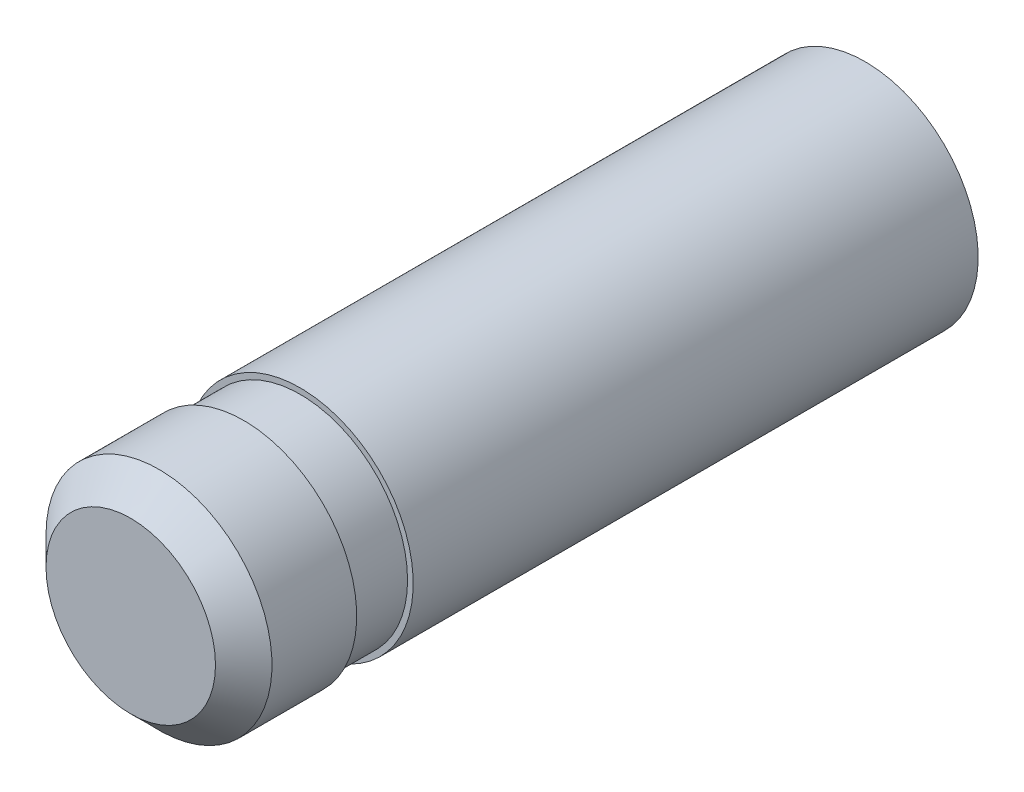
ISO-10303-21;
HEADER;
FILE_DESCRIPTION(('STEP AP214'),'2;1');
FILE_NAME('part.step','',(''),(''),'','','');
FILE_SCHEMA(('AUTOMOTIVE_DESIGN { 1 0 10303 214 1 1 1 1 }'));
ENDSEC;
DATA;
#1=APPLICATION_CONTEXT('core data for automotive mechanical design processes');
#2=APPLICATION_PROTOCOL_DEFINITION('international standard','automotive_design',2000,#1);
#3=PRODUCT_CONTEXT('',#1,'mechanical');
#4=PRODUCT('Part','Part','',(#3));
#5=PRODUCT_RELATED_PRODUCT_CATEGORY('part','',(#4));
#6=PRODUCT_DEFINITION_FORMATION('','',#4);
#7=PRODUCT_DEFINITION_CONTEXT('part definition',#1,'design');
#8=PRODUCT_DEFINITION('design','',#6,#7);
#9=PRODUCT_DEFINITION_SHAPE('','',#8);
#10=(LENGTH_UNIT() NAMED_UNIT(*) SI_UNIT(.MILLI.,.METRE.));
#11=(NAMED_UNIT(*) PLANE_ANGLE_UNIT() SI_UNIT($,.RADIAN.));
#12=(NAMED_UNIT(*) SI_UNIT($,.STERADIAN.) SOLID_ANGLE_UNIT());
#13=UNCERTAINTY_MEASURE_WITH_UNIT(LENGTH_MEASURE(1.E-05),#10,'distance_accuracy_value','');
#14=(GEOMETRIC_REPRESENTATION_CONTEXT(3) GLOBAL_UNCERTAINTY_ASSIGNED_CONTEXT((#13)) GLOBAL_UNIT_ASSIGNED_CONTEXT((#10,
#11,#12)) REPRESENTATION_CONTEXT('',''));
#15=CARTESIAN_POINT('',(0.,0.,0.));
#16=DIRECTION('',(0.,0.,1.));
#17=DIRECTION('',(1.,0.,0.));
#18=AXIS2_PLACEMENT_3D('',#15,#16,#17);
#19=CARTESIAN_POINT('',(0.,0.,13.));
#20=DIRECTION('',(0.,0.,-1.));
#21=DIRECTION('',(-1.,0.,0.));
#22=AXIS2_PLACEMENT_3D('',#19,#20,#21);
#23=CYLINDRICAL_SURFACE('',#22,2.);
#24=CARTESIAN_POINT('',(0.,0.,12.5));
#25=DIRECTION('',(0.,0.,1.));
#26=DIRECTION('',(1.,0.,0.));
#27=AXIS2_PLACEMENT_3D('',#24,#25,#26);
#28=CIRCLE('',#27,2.);
#29=CARTESIAN_POINT('',(-2.,0.,12.5));
#30=VERTEX_POINT('',#29);
#31=EDGE_CURVE('E11',#30,#30,#28,.F.);
#32=CARTESIAN_POINT('',(0.,0.,11.));
#33=DIRECTION('',(0.,0.,-1.));
#34=DIRECTION('',(-1.,0.,0.));
#35=AXIS2_PLACEMENT_3D('',#32,#33,#34);
#36=CIRCLE('',#35,2.);
#37=CARTESIAN_POINT('',(-2.,0.,11.));
#38=VERTEX_POINT('',#37);
#39=EDGE_CURVE('E59',#38,#38,#36,.T.);
#40=CARTESIAN_POINT('',(-2.,0.,12.5));
#41=CARTESIAN_POINT('',(-2.,0.,12.484375));
#42=CARTESIAN_POINT('',(-2.,0.,12.46875));
#43=CARTESIAN_POINT('',(-2.,0.,12.4375));
#44=CARTESIAN_POINT('',(-2.,0.,12.421875));
#45=CARTESIAN_POINT('',(-2.,0.,12.390625));
#46=CARTESIAN_POINT('',(-2.,0.,12.375));
#47=CARTESIAN_POINT('',(-2.,0.,12.34375));
#48=CARTESIAN_POINT('',(-2.,0.,12.328125));
#49=CARTESIAN_POINT('',(-2.,0.,12.296875));
#50=CARTESIAN_POINT('',(-2.,0.,12.28125));
#51=CARTESIAN_POINT('',(-2.,0.,12.25));
#52=CARTESIAN_POINT('',(-2.,0.,12.234375));
#53=CARTESIAN_POINT('',(-2.,0.,12.203125));
#54=CARTESIAN_POINT('',(-2.,0.,12.1875));
#55=CARTESIAN_POINT('',(-2.,0.,12.15625));
#56=CARTESIAN_POINT('',(-2.,0.,12.140625));
#57=CARTESIAN_POINT('',(-2.,0.,12.109375));
#58=CARTESIAN_POINT('',(-2.,0.,12.09375));
#59=CARTESIAN_POINT('',(-2.,0.,12.0625));
#60=CARTESIAN_POINT('',(-2.,0.,12.046875));
#61=CARTESIAN_POINT('',(-2.,0.,12.015625));
#62=CARTESIAN_POINT('',(-2.,0.,12.));
#63=CARTESIAN_POINT('',(-2.,0.,11.96875));
#64=CARTESIAN_POINT('',(-2.,0.,11.953125));
#65=CARTESIAN_POINT('',(-2.,0.,11.921875));
#66=CARTESIAN_POINT('',(-2.,0.,11.90625));
#67=CARTESIAN_POINT('',(-2.,0.,11.875));
#68=CARTESIAN_POINT('',(-2.,0.,11.859375));
#69=CARTESIAN_POINT('',(-2.,0.,11.828125));
#70=CARTESIAN_POINT('',(-2.,0.,11.8125));
#71=CARTESIAN_POINT('',(-2.,0.,11.78125));
#72=CARTESIAN_POINT('',(-2.,0.,11.765625));
#73=CARTESIAN_POINT('',(-2.,0.,11.734375));
#74=CARTESIAN_POINT('',(-2.,0.,11.71875));
#75=CARTESIAN_POINT('',(-2.,0.,11.6875));
#76=CARTESIAN_POINT('',(-2.,0.,11.671875));
#77=CARTESIAN_POINT('',(-2.,0.,11.640625));
#78=CARTESIAN_POINT('',(-2.,0.,11.625));
#79=CARTESIAN_POINT('',(-2.,0.,11.59375));
#80=CARTESIAN_POINT('',(-2.,0.,11.578125));
#81=CARTESIAN_POINT('',(-2.,0.,11.546875));
#82=CARTESIAN_POINT('',(-2.,0.,11.53125));
#83=CARTESIAN_POINT('',(-2.,0.,11.5));
#84=CARTESIAN_POINT('',(-2.,0.,11.484375));
#85=CARTESIAN_POINT('',(-2.,0.,11.453125));
#86=CARTESIAN_POINT('',(-2.,0.,11.4375));
#87=CARTESIAN_POINT('',(-2.,0.,11.40625));
#88=CARTESIAN_POINT('',(-2.,0.,11.390625));
#89=CARTESIAN_POINT('',(-2.,0.,11.359375));
#90=CARTESIAN_POINT('',(-2.,0.,11.34375));
#91=CARTESIAN_POINT('',(-2.,0.,11.3125));
#92=CARTESIAN_POINT('',(-2.,0.,11.296875));
#93=CARTESIAN_POINT('',(-2.,0.,11.265625));
#94=CARTESIAN_POINT('',(-2.,0.,11.25));
#95=CARTESIAN_POINT('',(-2.,0.,11.21875));
#96=CARTESIAN_POINT('',(-2.,0.,11.203125));
#97=CARTESIAN_POINT('',(-2.,0.,11.171875));
#98=CARTESIAN_POINT('',(-2.,0.,11.15625));
#99=CARTESIAN_POINT('',(-2.,0.,11.125));
#100=CARTESIAN_POINT('',(-2.,0.,11.109375));
#101=CARTESIAN_POINT('',(-2.,0.,11.078125));
#102=CARTESIAN_POINT('',(-2.,0.,11.0625));
#103=CARTESIAN_POINT('',(-2.,0.,11.03125));
#104=CARTESIAN_POINT('',(-2.,0.,11.015625));
#105=CARTESIAN_POINT('',(-2.,0.,11.));
#106=B_SPLINE_CURVE_WITH_KNOTS('',3,(#40,#41,#42,#43,#44,#45,#46,#47,#48,#49,#50,#51,#52,#53,
#54,#55,#56,#57,#58,#59,#60,#61,#62,#63,#64,#65,#66,#67,#68,#69,#70,#71,#72,#73,#74,#75,#76,#77,
#78,#79,#80,#81,#82,#83,#84,#85,#86,#87,#88,#89,#90,#91,#92,#93,#94,#95,#96,#97,#98,#99,#100,
#101,#102,#103,#104,#105),.UNSPECIFIED.,.F.,.F.,(4,2,2,2,2,2,2,2,2,2,2,2,2,2,2,2,2,2,2,2,2,2,2,
2,2,2,2,2,2,2,2,2,4),(0.,0.046875,0.0937500000000001,0.140625,0.1875,0.234375,0.28125,0.328125,
0.375,0.421875,0.46875,0.515625,0.5625,0.609375000000001,0.656250000000001,0.703125000000001,
0.750000000000001,0.796875000000001,0.843750000000001,0.890625000000001,0.937500000000001,
0.984375000000001,1.03125,1.078125,1.125,1.171875,1.21875,1.265625,1.3125,1.359375,1.40625,
1.453125,1.5),.UNSPECIFIED.);
#107=EDGE_CURVE('BSEAM40',#30,#38,#106,.T.);
#108=ORIENTED_EDGE('',*,*,#31,.T.);
#109=ORIENTED_EDGE('',*,*,#39,.F.);
#110=ORIENTED_EDGE('',*,*,#107,.T.);
#111=ORIENTED_EDGE('',*,*,#107,.F.);
#112=EDGE_LOOP('',(#108,#110,#109,#111));
#113=FACE_BOUND('',#112,.T.);
#114=ADVANCED_FACE('F40',(#113),#23,.T.);
#115=CARTESIAN_POINT('',(0.,0.,13.));
#116=DIRECTION('',(0.,0.,1.));
#117=DIRECTION('',(1.,0.,0.));
#118=AXIS2_PLACEMENT_3D('',#115,#116,#117);
#119=PLANE('',#118);
#120=CARTESIAN_POINT('',(0.,0.,13.));
#121=DIRECTION('',(0.,0.,1.));
#122=DIRECTION('',(1.,0.,0.));
#123=AXIS2_PLACEMENT_3D('',#120,#121,#122);
#124=CIRCLE('',#123,1.50000000000001);
#125=CARTESIAN_POINT('',(1.50000000000001,0.,13.));
#126=VERTEX_POINT('',#125);
#127=EDGE_CURVE('E49',#126,#126,#124,.T.);
#128=ORIENTED_EDGE('',*,*,#127,.T.);
#129=EDGE_LOOP('',(#128));
#130=FACE_BOUND('',#129,.T.);
#131=ADVANCED_FACE('F85',(#130),#119,.T.);
#132=CARTESIAN_POINT('',(0.,0.,11.));
#133=DIRECTION('',(0.,0.,-1.));
#134=DIRECTION('',(-1.,0.,0.));
#135=AXIS2_PLACEMENT_3D('',#132,#133,#134);
#136=PLANE('',#135);
#137=CARTESIAN_POINT('',(0.,0.,11.));
#138=DIRECTION('',(0.,0.,-1.));
#139=DIRECTION('',(-1.,0.,0.));
#140=AXIS2_PLACEMENT_3D('',#137,#138,#139);
#141=CIRCLE('',#140,1.9);
#142=CARTESIAN_POINT('',(-1.9,0.,11.));
#143=VERTEX_POINT('',#142);
#144=EDGE_CURVE('E68',#143,#143,#141,.T.);
#145=ORIENTED_EDGE('',*,*,#144,.F.);
#146=EDGE_LOOP('',(#145));
#147=FACE_BOUND('',#146,.T.);
#148=ORIENTED_EDGE('',*,*,#39,.T.);
#149=EDGE_LOOP('',(#148));
#150=FACE_BOUND('',#149,.T.);
#151=ADVANCED_FACE('F81',(#147,#150),#136,.T.);
#152=CARTESIAN_POINT('',(0.,0.,10.));
#153=DIRECTION('',(0.,0.,-1.));
#154=DIRECTION('',(-1.,0.,0.));
#155=AXIS2_PLACEMENT_3D('',#152,#153,#154);
#156=PLANE('',#155);
#157=CARTESIAN_POINT('',(0.,0.,10.));
#158=DIRECTION('',(0.,0.,-1.));
#159=DIRECTION('',(-1.,0.,0.));
#160=AXIS2_PLACEMENT_3D('',#157,#158,#159);
#161=CIRCLE('',#160,1.9);
#162=CARTESIAN_POINT('',(-1.9,0.,10.));
#163=VERTEX_POINT('',#162);
#164=EDGE_CURVE('E70',#163,#163,#161,.T.);
#165=ORIENTED_EDGE('',*,*,#164,.T.);
#166=EDGE_LOOP('',(#165));
#167=FACE_BOUND('',#166,.T.);
#168=CARTESIAN_POINT('',(0.,0.,10.));
#169=DIRECTION('',(0.,0.,-1.));
#170=DIRECTION('',(-1.,0.,0.));
#171=AXIS2_PLACEMENT_3D('',#168,#169,#170);
#172=CIRCLE('',#171,2.);
#173=CARTESIAN_POINT('',(-2.,0.,10.));
#174=VERTEX_POINT('',#173);
#175=EDGE_CURVE('E65',#174,#174,#172,.T.);
#176=ORIENTED_EDGE('',*,*,#175,.F.);
#177=EDGE_LOOP('',(#176));
#178=FACE_BOUND('',#177,.T.);
#179=ADVANCED_FACE('F84',(#167,#178),#156,.F.);
#180=CARTESIAN_POINT('',(0.,0.,11.));
#181=DIRECTION('',(0.,0.,-1.));
#182=DIRECTION('',(-1.,0.,0.));
#183=AXIS2_PLACEMENT_3D('',#180,#181,#182);
#184=CYLINDRICAL_SURFACE('',#183,1.9);
#185=ORIENTED_EDGE('',*,*,#144,.T.);
#186=EDGE_LOOP('',(#185));
#187=FACE_BOUND('',#186,.T.);
#188=ORIENTED_EDGE('',*,*,#164,.F.);
#189=EDGE_LOOP('',(#188));
#190=FACE_BOUND('',#189,.T.);
#191=ADVANCED_FACE('F78',(#187,#190),#184,.T.);
#192=CARTESIAN_POINT('',(0.,0.,0.));
#193=DIRECTION('',(0.,0.,1.));
#194=DIRECTION('',(1.,0.,0.));
#195=AXIS2_PLACEMENT_3D('',#192,#193,#194);
#196=PLANE('',#195);
#197=CARTESIAN_POINT('',(0.,0.,0.));
#198=DIRECTION('',(0.,0.,1.));
#199=DIRECTION('',(1.,0.,0.));
#200=AXIS2_PLACEMENT_3D('',#197,#198,#199);
#201=CIRCLE('',#200,2.);
#202=CARTESIAN_POINT('',(-2.,0.,0.));
#203=VERTEX_POINT('',#202);
#204=EDGE_CURVE('E54',#203,#203,#201,.T.);
#205=ORIENTED_EDGE('',*,*,#204,.F.);
#206=EDGE_LOOP('',(#205));
#207=FACE_BOUND('',#206,.T.);
#208=ADVANCED_FACE('F97',(#207),#196,.F.);
#209=CARTESIAN_POINT('',(-2.,0.,10.));
#210=CARTESIAN_POINT('',(-2.,0.,9.89583333333333));
#211=CARTESIAN_POINT('',(-2.,0.,9.79166666666667));
#212=CARTESIAN_POINT('',(-2.,0.,9.58333333333333));
#213=CARTESIAN_POINT('',(-2.,0.,9.47916666666667));
#214=CARTESIAN_POINT('',(-2.,0.,9.27083333333333));
#215=CARTESIAN_POINT('',(-2.,0.,9.16666666666667));
#216=CARTESIAN_POINT('',(-2.,0.,8.95833333333333));
#217=CARTESIAN_POINT('',(-2.,0.,8.85416666666667));
#218=CARTESIAN_POINT('',(-2.,0.,8.64583333333333));
#219=CARTESIAN_POINT('',(-2.,0.,8.54166666666667));
#220=CARTESIAN_POINT('',(-2.,0.,8.33333333333333));
#221=CARTESIAN_POINT('',(-2.,0.,8.22916666666667));
#222=CARTESIAN_POINT('',(-2.,0.,8.02083333333333));
#223=CARTESIAN_POINT('',(-2.,0.,7.91666666666667));
#224=CARTESIAN_POINT('',(-2.,0.,7.70833333333333));
#225=CARTESIAN_POINT('',(-2.,0.,7.60416666666667));
#226=CARTESIAN_POINT('',(-2.,0.,7.39583333333333));
#227=CARTESIAN_POINT('',(-2.,0.,7.29166666666667));
#228=CARTESIAN_POINT('',(-2.,0.,7.08333333333333));
#229=CARTESIAN_POINT('',(-2.,0.,6.97916666666667));
#230=CARTESIAN_POINT('',(-2.,0.,6.77083333333333));
#231=CARTESIAN_POINT('',(-2.,0.,6.66666666666667));
#232=CARTESIAN_POINT('',(-2.,0.,6.45833333333333));
#233=CARTESIAN_POINT('',(-2.,0.,6.35416666666667));
#234=CARTESIAN_POINT('',(-2.,0.,6.14583333333333));
#235=CARTESIAN_POINT('',(-2.,0.,6.04166666666667));
#236=CARTESIAN_POINT('',(-2.,0.,5.83333333333333));
#237=CARTESIAN_POINT('',(-2.,0.,5.72916666666667));
#238=CARTESIAN_POINT('',(-2.,0.,5.52083333333333));
#239=CARTESIAN_POINT('',(-2.,0.,5.41666666666667));
#240=CARTESIAN_POINT('',(-2.,0.,5.20833333333333));
#241=CARTESIAN_POINT('',(-2.,0.,5.10416666666667));
#242=CARTESIAN_POINT('',(-2.,0.,4.89583333333333));
#243=CARTESIAN_POINT('',(-2.,0.,4.79166666666667));
#244=CARTESIAN_POINT('',(-2.,0.,4.58333333333333));
#245=CARTESIAN_POINT('',(-2.,0.,4.47916666666667));
#246=CARTESIAN_POINT('',(-2.,0.,4.27083333333333));
#247=CARTESIAN_POINT('',(-2.,0.,4.16666666666667));
#248=CARTESIAN_POINT('',(-2.,0.,3.95833333333333));
#249=CARTESIAN_POINT('',(-2.,0.,3.85416666666667));
#250=CARTESIAN_POINT('',(-2.,0.,3.64583333333333));
#251=CARTESIAN_POINT('',(-2.,0.,3.54166666666667));
#252=CARTESIAN_POINT('',(-2.,0.,3.33333333333333));
#253=CARTESIAN_POINT('',(-2.,0.,3.22916666666667));
#254=CARTESIAN_POINT('',(-2.,0.,3.02083333333333));
#255=CARTESIAN_POINT('',(-2.,0.,2.91666666666667));
#256=CARTESIAN_POINT('',(-2.,0.,2.70833333333333));
#257=CARTESIAN_POINT('',(-2.,0.,2.60416666666667));
#258=CARTESIAN_POINT('',(-2.,0.,2.39583333333333));
#259=CARTESIAN_POINT('',(-2.,0.,2.29166666666667));
#260=CARTESIAN_POINT('',(-2.,0.,2.08333333333333));
#261=CARTESIAN_POINT('',(-2.,0.,1.97916666666667));
#262=CARTESIAN_POINT('',(-2.,0.,1.77083333333333));
#263=CARTESIAN_POINT('',(-2.,0.,1.66666666666667));
#264=CARTESIAN_POINT('',(-2.,0.,1.45833333333333));
#265=CARTESIAN_POINT('',(-2.,0.,1.35416666666667));
#266=CARTESIAN_POINT('',(-2.,0.,1.14583333333333));
#267=CARTESIAN_POINT('',(-2.,0.,1.04166666666667));
#268=CARTESIAN_POINT('',(-2.,0.,0.833333333333334));
#269=CARTESIAN_POINT('',(-2.,0.,0.729166666666667));
#270=CARTESIAN_POINT('',(-2.,0.,0.520833333333334));
#271=CARTESIAN_POINT('',(-2.,0.,0.416666666666667));
#272=CARTESIAN_POINT('',(-2.,0.,0.208333333333334));
#273=CARTESIAN_POINT('',(-2.,0.,0.104166666666667));
#274=CARTESIAN_POINT('',(-2.,0.,0.));
#275=B_SPLINE_CURVE_WITH_KNOTS('',3,(#209,#210,#211,#212,#213,#214,#215,#216,#217,#218,#219,
#220,#221,#222,#223,#224,#225,#226,#227,#228,#229,#230,#231,#232,#233,#234,#235,#236,#237,#238,
#239,#240,#241,#242,#243,#244,#245,#246,#247,#248,#249,#250,#251,#252,#253,#254,#255,#256,#257,
#258,#259,#260,#261,#262,#263,#264,#265,#266,#267,#268,#269,#270,#271,#272,#273,#274),
.UNSPECIFIED.,.F.,.F.,(4,2,2,2,2,2,2,2,2,2,2,2,2,2,2,2,2,2,2,2,2,2,2,2,2,2,2,2,2,2,2,2,4),(0.,
0.3125,0.624999999999999,0.937499999999999,1.25,1.5625,1.875,2.1875,2.5,2.8125,3.125,3.4375,
3.75,4.0625,4.375,4.6875,5.,5.3125,5.625,5.9375,6.25,6.5625,6.875,7.1875,7.5,7.8125,8.125,
8.4375,8.75,9.0625,9.375,9.6875,10.),.UNSPECIFIED.);
#276=EDGE_CURVE('BSEAM90',#174,#203,#275,.T.);
#277=ORIENTED_EDGE('',*,*,#175,.T.);
#278=ORIENTED_EDGE('',*,*,#204,.T.);
#279=ORIENTED_EDGE('',*,*,#276,.T.);
#280=ORIENTED_EDGE('',*,*,#276,.F.);
#281=EDGE_LOOP('',(#277,#279,#278,#280));
#282=FACE_BOUND('',#281,.T.);
#283=ADVANCED_FACE('F90',(#282),#23,.T.);
#284=CARTESIAN_POINT('',(0.,0.,13.));
#285=DIRECTION('',(0.,0.,-1.));
#286=DIRECTION('',(-1.,0.,0.));
#287=AXIS2_PLACEMENT_3D('',#284,#285,#286);
#288=CONICAL_SURFACE('',#287,1.50000000000001,0.785398163397447);
#289=ORIENTED_EDGE('',*,*,#31,.F.);
#290=EDGE_LOOP('',(#289));
#291=FACE_BOUND('',#290,.T.);
#292=ORIENTED_EDGE('',*,*,#127,.F.);
#293=EDGE_LOOP('',(#292));
#294=FACE_BOUND('',#293,.T.);
#295=ADVANCED_FACE('F43',(#291,#294),#288,.T.);
#296=CLOSED_SHELL('',(#114,#131,#151,#179,#191,#208,#283,#295));
#297=MANIFOLD_SOLID_BREP('B2',#296);
#298=ADVANCED_BREP_SHAPE_REPRESENTATION('',(#18,#297),#14);
#299=SHAPE_DEFINITION_REPRESENTATION(#9,#298);
ENDSEC;
END-ISO-10303-21;
